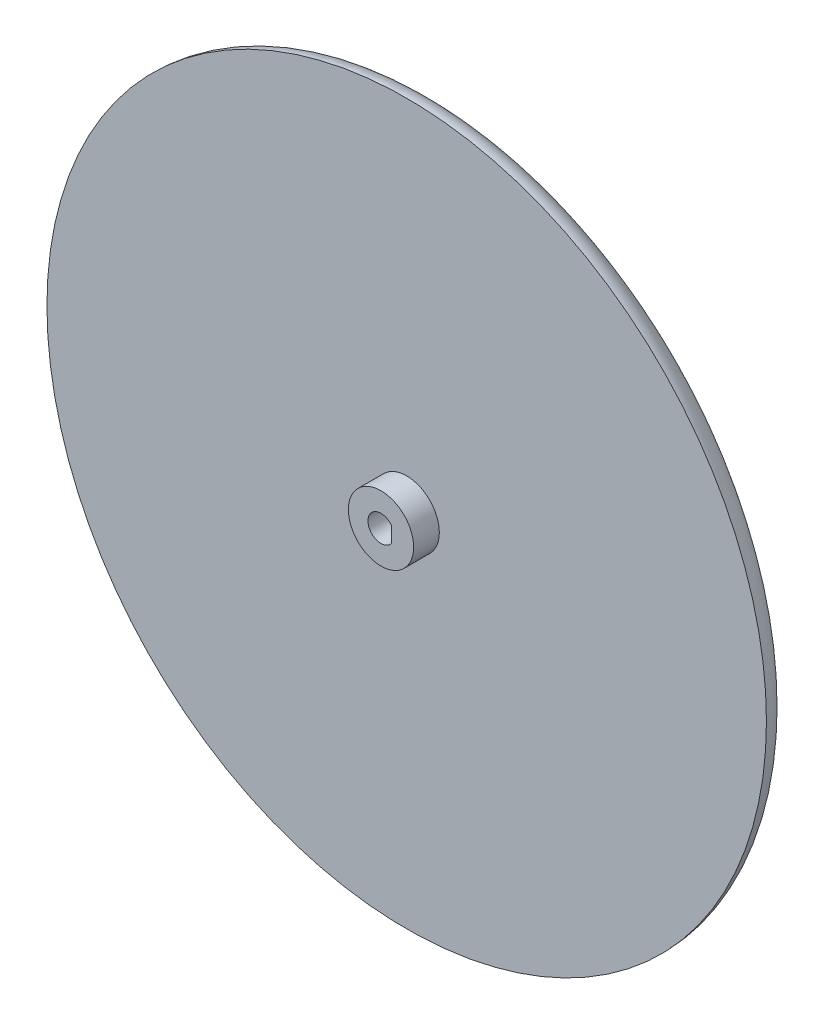
ISO-10303-21;
HEADER;
FILE_DESCRIPTION(('STEP AP214'),'2;1');
FILE_NAME('part.step','',(''),(''),'','','');
FILE_SCHEMA(('AUTOMOTIVE_DESIGN { 1 0 10303 214 1 1 1 1 }'));
ENDSEC;
DATA;
#1=APPLICATION_CONTEXT('core data for automotive mechanical design processes');
#2=APPLICATION_PROTOCOL_DEFINITION('international standard','automotive_design',2000,#1);
#3=PRODUCT_CONTEXT('',#1,'mechanical');
#4=PRODUCT('Part','Part','',(#3));
#5=PRODUCT_RELATED_PRODUCT_CATEGORY('part','',(#4));
#6=PRODUCT_DEFINITION_FORMATION('','',#4);
#7=PRODUCT_DEFINITION_CONTEXT('part definition',#1,'design');
#8=PRODUCT_DEFINITION('design','',#6,#7);
#9=PRODUCT_DEFINITION_SHAPE('','',#8);
#10=(LENGTH_UNIT() NAMED_UNIT(*) SI_UNIT(.MILLI.,.METRE.));
#11=(NAMED_UNIT(*) PLANE_ANGLE_UNIT() SI_UNIT($,.RADIAN.));
#12=(NAMED_UNIT(*) SI_UNIT($,.STERADIAN.) SOLID_ANGLE_UNIT());
#13=UNCERTAINTY_MEASURE_WITH_UNIT(LENGTH_MEASURE(1.E-05),#10,'distance_accuracy_value','');
#14=(GEOMETRIC_REPRESENTATION_CONTEXT(3) GLOBAL_UNCERTAINTY_ASSIGNED_CONTEXT((#13)) GLOBAL_UNIT_ASSIGNED_CONTEXT((#10,
#11,#12)) REPRESENTATION_CONTEXT('',''));
#15=CARTESIAN_POINT('',(0.,0.,0.));
#16=DIRECTION('',(0.,0.,1.));
#17=DIRECTION('',(1.,0.,0.));
#18=AXIS2_PLACEMENT_3D('',#15,#16,#17);
#19=CARTESIAN_POINT('',(0.,0.,10.));
#20=DIRECTION('',(0.,0.,-1.));
#21=DIRECTION('',(-1.,0.,0.));
#22=AXIS2_PLACEMENT_3D('',#19,#20,#21);
#23=CYLINDRICAL_SURFACE('',#22,6.35);
#24=CARTESIAN_POINT('',(0.,0.,5.));
#25=DIRECTION('',(0.,0.,1.));
#26=DIRECTION('',(1.,0.,0.));
#27=AXIS2_PLACEMENT_3D('',#24,#25,#26);
#28=CIRCLE('',#27,6.35);
#29=CARTESIAN_POINT('',(6.35,0.,5.));
#30=VERTEX_POINT('',#29);
#31=EDGE_CURVE('E69',#30,#30,#28,.T.);
#32=ORIENTED_EDGE('',*,*,#31,.T.);
#33=EDGE_LOOP('',(#32));
#34=FACE_BOUND('',#33,.T.);
#35=CARTESIAN_POINT('',(0.,0.,10.));
#36=DIRECTION('',(0.,0.,1.));
#37=DIRECTION('',(1.,0.,0.));
#38=AXIS2_PLACEMENT_3D('',#35,#36,#37);
#39=CIRCLE('',#38,6.35);
#40=CARTESIAN_POINT('',(6.35,0.,10.));
#41=VERTEX_POINT('',#40);
#42=EDGE_CURVE('E65',#41,#41,#39,.T.);
#43=ORIENTED_EDGE('',*,*,#42,.F.);
#44=EDGE_LOOP('',(#43));
#45=FACE_BOUND('',#44,.T.);
#46=ADVANCED_FACE('F36',(#34,#45),#23,.T.);
#47=CARTESIAN_POINT('',(0.,0.,10.));
#48=DIRECTION('',(0.,0.,1.));
#49=DIRECTION('',(1.,0.,0.));
#50=AXIS2_PLACEMENT_3D('',#47,#48,#49);
#51=PLANE('',#50);
#52=CARTESIAN_POINT('',(0.,0.,10.));
#53=DIRECTION('',(0.,0.,1.));
#54=DIRECTION('',(1.,0.,0.));
#55=AXIS2_PLACEMENT_3D('',#52,#53,#54);
#56=CIRCLE('',#55,2.54);
#57=CARTESIAN_POINT('',(2.04202590281059,1.51053970892876,10.));
#58=VERTEX_POINT('',#57);
#59=CARTESIAN_POINT('',(2.04202590281059,-1.51053970892876,10.));
#60=VERTEX_POINT('',#59);
#61=EDGE_CURVE('E82',#58,#60,#56,.T.);
#62=ORIENTED_EDGE('',*,*,#61,.F.);
#63=DIRECTION('',(0.,1.,0.));
#64=VECTOR('',#63,1.);
#65=CARTESIAN_POINT('',(2.04202590281059,-1.51053970892876,10.));
#66=LINE('',#65,#64);
#67=EDGE_CURVE('E74',#60,#58,#66,.T.);
#68=ORIENTED_EDGE('',*,*,#67,.F.);
#69=EDGE_LOOP('',(#62,#68));
#70=FACE_BOUND('',#69,.T.);
#71=ORIENTED_EDGE('',*,*,#42,.T.);
#72=EDGE_LOOP('',(#71));
#73=FACE_BOUND('',#72,.T.);
#74=ADVANCED_FACE('F102',(#70,#73),#51,.T.);
#75=CARTESIAN_POINT('',(0.,0.,0.));
#76=DIRECTION('',(0.,0.,1.));
#77=DIRECTION('',(1.,0.,0.));
#78=AXIS2_PLACEMENT_3D('',#75,#76,#77);
#79=CYLINDRICAL_SURFACE('',#78,2.54);
#80=DIRECTION('',(0.,0.,1.));
#81=VECTOR('',#80,1.);
#82=CARTESIAN_POINT('',(2.04202590281059,-1.51053970892876,0.));
#83=LINE('',#82,#81);
#84=CARTESIAN_POINT('',(2.04202590281059,-1.51053970892876,5.));
#85=VERTEX_POINT('',#84);
#86=EDGE_CURVE('E57',#85,#60,#83,.T.);
#87=ORIENTED_EDGE('',*,*,#86,.F.);
#88=CARTESIAN_POINT('',(0.,0.,5.));
#89=DIRECTION('',(0.,0.,1.));
#90=DIRECTION('',(1.,0.,0.));
#91=AXIS2_PLACEMENT_3D('',#88,#89,#90);
#92=CIRCLE('',#91,2.54);
#93=CARTESIAN_POINT('',(2.04202590281059,1.51053970892876,5.));
#94=VERTEX_POINT('',#93);
#95=EDGE_CURVE('E50',#85,#94,#92,.F.);
#96=ORIENTED_EDGE('',*,*,#95,.T.);
#97=DIRECTION('',(0.,0.,1.));
#98=VECTOR('',#97,1.);
#99=CARTESIAN_POINT('',(2.04202590281059,1.51053970892876,0.));
#100=LINE('',#99,#98);
#101=EDGE_CURVE('E68',#94,#58,#100,.T.);
#102=ORIENTED_EDGE('',*,*,#101,.T.);
#103=ORIENTED_EDGE('',*,*,#61,.T.);
#104=EDGE_LOOP('',(#87,#96,#102,#103));
#105=FACE_BOUND('',#104,.T.);
#106=ADVANCED_FACE('F67',(#105),#79,.F.);
#107=CARTESIAN_POINT('',(2.04202590281059,-1.51053970892876,0.));
#108=DIRECTION('',(1.,0.,0.));
#109=DIRECTION('',(0.,0.,-1.));
#110=AXIS2_PLACEMENT_3D('',#107,#108,#109);
#111=PLANE('',#110);
#112=ORIENTED_EDGE('',*,*,#101,.F.);
#113=DIRECTION('',(0.,-1.,0.));
#114=VECTOR('',#113,1.);
#115=CARTESIAN_POINT('',(2.04202590281059,-1.51053970892876,5.));
#116=LINE('',#115,#114);
#117=EDGE_CURVE('E44',#94,#85,#116,.T.);
#118=ORIENTED_EDGE('',*,*,#117,.T.);
#119=ORIENTED_EDGE('',*,*,#86,.T.);
#120=ORIENTED_EDGE('',*,*,#67,.T.);
#121=EDGE_LOOP('',(#112,#118,#119,#120));
#122=FACE_BOUND('',#121,.T.);
#123=ADVANCED_FACE('F72',(#122),#111,.F.);
#124=CARTESIAN_POINT('',(0.,0.,5.));
#125=DIRECTION('',(0.,0.,1.));
#126=DIRECTION('',(1.,0.,0.));
#127=AXIS2_PLACEMENT_3D('',#124,#125,#126);
#128=PLANE('',#127);
#129=ORIENTED_EDGE('',*,*,#95,.F.);
#130=ORIENTED_EDGE('',*,*,#117,.F.);
#131=EDGE_LOOP('',(#129,#130));
#132=FACE_BOUND('',#131,.T.);
#133=ADVANCED_FACE('F63',(#132),#128,.T.);
#134=CARTESIAN_POINT('',(0.,0.,5.));
#135=DIRECTION('',(0.,0.,1.));
#136=DIRECTION('',(1.,0.,0.));
#137=AXIS2_PLACEMENT_3D('',#134,#135,#136);
#138=CIRCLE('',#137,70.);
#139=CARTESIAN_POINT('',(70.,0.,5.));
#140=VERTEX_POINT('',#139);
#141=EDGE_CURVE('E70',#140,#140,#138,.T.);
#142=ORIENTED_EDGE('',*,*,#141,.T.);
#143=EDGE_LOOP('',(#142));
#144=FACE_BOUND('',#143,.T.);
#145=ORIENTED_EDGE('',*,*,#31,.F.);
#146=EDGE_LOOP('',(#145));
#147=FACE_BOUND('',#146,.T.);
#148=ADVANCED_FACE('F89',(#144,#147),#128,.T.);
#149=CARTESIAN_POINT('',(0.,0.,0.));
#150=DIRECTION('',(0.,0.,1.));
#151=DIRECTION('',(1.,0.,0.));
#152=AXIS2_PLACEMENT_3D('',#149,#150,#151);
#153=PLANE('',#152);
#154=CARTESIAN_POINT('',(0.,0.,0.));
#155=DIRECTION('',(0.,0.,1.));
#156=DIRECTION('',(1.,0.,0.));
#157=AXIS2_PLACEMENT_3D('',#154,#155,#156);
#158=CIRCLE('',#157,65.);
#159=CARTESIAN_POINT('',(65.,0.,0.));
#160=VERTEX_POINT('',#159);
#161=EDGE_CURVE('E11',#160,#160,#158,.F.);
#162=ORIENTED_EDGE('',*,*,#161,.T.);
#163=EDGE_LOOP('',(#162));
#164=FACE_BOUND('',#163,.T.);
#165=ADVANCED_FACE('F93',(#164),#153,.F.);
#166=CARTESIAN_POINT('',(0.,0.,5.));
#167=DIRECTION('',(0.,0.,1.));
#168=DIRECTION('',(1.,0.,0.));
#169=AXIS2_PLACEMENT_3D('',#166,#167,#168);
#170=TOROIDAL_SURFACE('',#169,65.,5.);
#171=ORIENTED_EDGE('',*,*,#161,.F.);
#172=EDGE_LOOP('',(#171));
#173=FACE_BOUND('',#172,.T.);
#174=ORIENTED_EDGE('',*,*,#141,.F.);
#175=EDGE_LOOP('',(#174));
#176=FACE_BOUND('',#175,.T.);
#177=ADVANCED_FACE('F38',(#173,#176),#170,.T.);
#178=CLOSED_SHELL('',(#46,#74,#106,#123,#133,#148,#165,#177));
#179=MANIFOLD_SOLID_BREP('B2',#178);
#180=ADVANCED_BREP_SHAPE_REPRESENTATION('',(#18,#179),#14);
#181=SHAPE_DEFINITION_REPRESENTATION(#9,#180);
ENDSEC;
END-ISO-10303-21;
